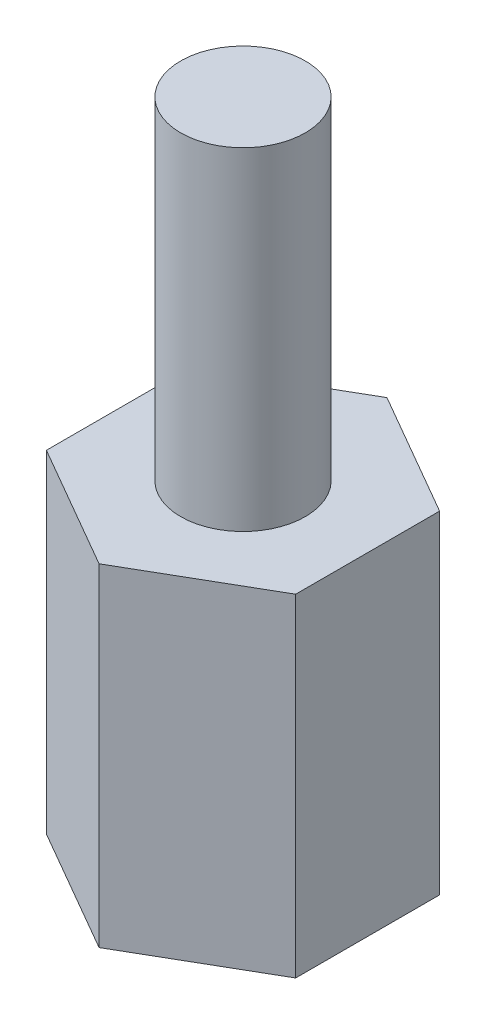
ISO-10303-21;
HEADER;
FILE_DESCRIPTION(('STEP AP214'),'2;1');
FILE_NAME('part.step','',(''),(''),'','','');
FILE_SCHEMA(('AUTOMOTIVE_DESIGN { 1 0 10303 214 1 1 1 1 }'));
ENDSEC;
DATA;
#1=APPLICATION_CONTEXT('core data for automotive mechanical design processes');
#2=APPLICATION_PROTOCOL_DEFINITION('international standard','automotive_design',2000,#1);
#3=PRODUCT_CONTEXT('',#1,'mechanical');
#4=PRODUCT('Part','Part','',(#3));
#5=PRODUCT_RELATED_PRODUCT_CATEGORY('part','',(#4));
#6=PRODUCT_DEFINITION_FORMATION('','',#4);
#7=PRODUCT_DEFINITION_CONTEXT('part definition',#1,'design');
#8=PRODUCT_DEFINITION('design','',#6,#7);
#9=PRODUCT_DEFINITION_SHAPE('','',#8);
#10=(LENGTH_UNIT() NAMED_UNIT(*) SI_UNIT(.MILLI.,.METRE.));
#11=(NAMED_UNIT(*) PLANE_ANGLE_UNIT() SI_UNIT($,.RADIAN.));
#12=(NAMED_UNIT(*) SI_UNIT($,.STERADIAN.) SOLID_ANGLE_UNIT());
#13=UNCERTAINTY_MEASURE_WITH_UNIT(LENGTH_MEASURE(1.E-05),#10,'distance_accuracy_value','');
#14=(GEOMETRIC_REPRESENTATION_CONTEXT(3) GLOBAL_UNCERTAINTY_ASSIGNED_CONTEXT((#13)) GLOBAL_UNIT_ASSIGNED_CONTEXT((#10,
#11,#12)) REPRESENTATION_CONTEXT('',''));
#15=CARTESIAN_POINT('',(0.,0.,0.));
#16=DIRECTION('',(0.,0.,1.));
#17=DIRECTION('',(1.,0.,0.));
#18=AXIS2_PLACEMENT_3D('',#15,#16,#17);
#19=CARTESIAN_POINT('',(0.,8.,0.));
#20=DIRECTION('',(0.,-1.,0.));
#21=DIRECTION('',(0.,0.,-1.));
#22=AXIS2_PLACEMENT_3D('',#19,#20,#21);
#23=CYLINDRICAL_SURFACE('',#22,1.5);
#24=CARTESIAN_POINT('',(0.,0.,0.));
#25=DIRECTION('',(0.,1.,0.));
#26=DIRECTION('',(0.,0.,1.));
#27=AXIS2_PLACEMENT_3D('',#24,#25,#26);
#28=CIRCLE('',#27,1.5);
#29=CARTESIAN_POINT('',(0.,0.,1.5));
#30=VERTEX_POINT('',#29);
#31=EDGE_CURVE('E229',#30,#30,#28,.T.);
#32=ORIENTED_EDGE('',*,*,#31,.F.);
#33=EDGE_LOOP('',(#32));
#34=FACE_BOUND('',#33,.T.);
#35=CARTESIAN_POINT('',(0.,5.,0.));
#36=DIRECTION('',(0.,1.,0.));
#37=DIRECTION('',(0.,0.,1.));
#38=AXIS2_PLACEMENT_3D('',#35,#36,#37);
#39=CIRCLE('',#38,1.5);
#40=CARTESIAN_POINT('',(0.,5.,1.5));
#41=VERTEX_POINT('',#40);
#42=EDGE_CURVE('E230',#41,#41,#39,.T.);
#43=ORIENTED_EDGE('',*,*,#42,.T.);
#44=EDGE_LOOP('',(#43));
#45=FACE_BOUND('',#44,.T.);
#46=ADVANCED_FACE('F33',(#34,#45),#23,.F.);
#47=CARTESIAN_POINT('',(0.,8.,0.));
#48=DIRECTION('',(0.,1.,0.));
#49=DIRECTION('',(0.,0.,1.));
#50=AXIS2_PLACEMENT_3D('',#47,#48,#49);
#51=PLANE('',#50);
#52=DIRECTION('',(-0.866025403784441,0.,-0.499999999999995));
#53=VECTOR('',#52,1.);
#54=CARTESIAN_POINT('',(2.99999999999998,8.,-1.73205080756891));
#55=LINE('',#54,#53);
#56=CARTESIAN_POINT('',(2.99999999999998,8.,-1.73205080756891));
#57=VERTEX_POINT('',#56);
#58=CARTESIAN_POINT('',(0.,8.,-3.46410161513775));
#59=VERTEX_POINT('',#58);
#60=EDGE_CURVE('E130',#57,#59,#55,.T.);
#61=ORIENTED_EDGE('',*,*,#60,.T.);
#62=DIRECTION('',(-0.866025403784438,0.,0.500000000000001));
#63=VECTOR('',#62,1.);
#64=CARTESIAN_POINT('',(0.,8.,-3.46410161513775));
#65=LINE('',#64,#63);
#66=CARTESIAN_POINT('',(-3.,8.,-1.73205080756887));
#67=VERTEX_POINT('',#66);
#68=EDGE_CURVE('E87',#59,#67,#65,.T.);
#69=ORIENTED_EDGE('',*,*,#68,.T.);
#70=DIRECTION('',(0.,0.,1.));
#71=VECTOR('',#70,1.);
#72=CARTESIAN_POINT('',(-3.,8.,-1.73205080756887));
#73=LINE('',#72,#71);
#74=CARTESIAN_POINT('',(-2.99999999999999,8.,1.73205080756889));
#75=VERTEX_POINT('',#74);
#76=EDGE_CURVE('E101',#67,#75,#73,.T.);
#77=ORIENTED_EDGE('',*,*,#76,.T.);
#78=DIRECTION('',(0.866025403784441,0.,0.499999999999995));
#79=VECTOR('',#78,1.);
#80=CARTESIAN_POINT('',(-2.99999999999999,8.,1.73205080756889));
#81=LINE('',#80,#79);
#82=CARTESIAN_POINT('',(0.,8.,3.46410161513775));
#83=VERTEX_POINT('',#82);
#84=EDGE_CURVE('E94',#75,#83,#81,.T.);
#85=ORIENTED_EDGE('',*,*,#84,.T.);
#86=DIRECTION('',(0.866025403784434,0.,-0.500000000000007));
#87=VECTOR('',#86,1.);
#88=CARTESIAN_POINT('',(0.,8.,3.46410161513775));
#89=LINE('',#88,#87);
#90=CARTESIAN_POINT('',(3.00000000000001,8.,1.73205080756885));
#91=VERTEX_POINT('',#90);
#92=EDGE_CURVE('E99',#83,#91,#89,.T.);
#93=ORIENTED_EDGE('',*,*,#92,.T.);
#94=DIRECTION('',(0.,0.,-1.));
#95=VECTOR('',#94,1.);
#96=CARTESIAN_POINT('',(3.00000000000001,8.,1.73205080756885));
#97=LINE('',#96,#95);
#98=EDGE_CURVE('E50',#91,#57,#97,.T.);
#99=ORIENTED_EDGE('',*,*,#98,.T.);
#100=EDGE_LOOP('',(#61,#69,#77,#85,#93,#99));
#101=FACE_BOUND('',#100,.T.);
#102=CARTESIAN_POINT('',(0.,8.,0.));
#103=DIRECTION('',(0.,1.,0.));
#104=DIRECTION('',(0.,0.,1.));
#105=AXIS2_PLACEMENT_3D('',#102,#103,#104);
#106=CIRCLE('',#105,1.5);
#107=CARTESIAN_POINT('',(0.,8.,1.5));
#108=VERTEX_POINT('',#107);
#109=EDGE_CURVE('E123',#108,#108,#106,.T.);
#110=ORIENTED_EDGE('',*,*,#109,.F.);
#111=EDGE_LOOP('',(#110));
#112=FACE_BOUND('',#111,.T.);
#113=ADVANCED_FACE('F96',(#101,#112),#51,.T.);
#114=CARTESIAN_POINT('',(0.,0.,0.));
#115=DIRECTION('',(0.,1.,0.));
#116=DIRECTION('',(0.,0.,1.));
#117=AXIS2_PLACEMENT_3D('',#114,#115,#116);
#118=PLANE('',#117);
#119=DIRECTION('',(-0.866025403784441,0.,-0.499999999999995));
#120=VECTOR('',#119,1.);
#121=CARTESIAN_POINT('',(2.99999999999998,0.,-1.73205080756891));
#122=LINE('',#121,#120);
#123=CARTESIAN_POINT('',(2.99999999999998,0.,-1.73205080756891));
#124=VERTEX_POINT('',#123);
#125=CARTESIAN_POINT('',(0.,0.,-3.46410161513775));
#126=VERTEX_POINT('',#125);
#127=EDGE_CURVE('E119',#124,#126,#122,.T.);
#128=ORIENTED_EDGE('',*,*,#127,.F.);
#129=DIRECTION('',(0.,0.,-1.));
#130=VECTOR('',#129,1.);
#131=CARTESIAN_POINT('',(3.00000000000001,0.,1.73205080756885));
#132=LINE('',#131,#130);
#133=CARTESIAN_POINT('',(3.00000000000001,0.,1.73205080756885));
#134=VERTEX_POINT('',#133);
#135=EDGE_CURVE('E79',#134,#124,#132,.T.);
#136=ORIENTED_EDGE('',*,*,#135,.F.);
#137=DIRECTION('',(0.866025403784434,0.,-0.500000000000007));
#138=VECTOR('',#137,1.);
#139=CARTESIAN_POINT('',(0.,0.,3.46410161513775));
#140=LINE('',#139,#138);
#141=CARTESIAN_POINT('',(0.,0.,3.46410161513775));
#142=VERTEX_POINT('',#141);
#143=EDGE_CURVE('E73',#142,#134,#140,.T.);
#144=ORIENTED_EDGE('',*,*,#143,.F.);
#145=DIRECTION('',(0.866025403784441,0.,0.499999999999995));
#146=VECTOR('',#145,1.);
#147=CARTESIAN_POINT('',(-2.99999999999999,0.,1.73205080756889));
#148=LINE('',#147,#146);
#149=CARTESIAN_POINT('',(-2.99999999999999,0.,1.73205080756889));
#150=VERTEX_POINT('',#149);
#151=EDGE_CURVE('E109',#150,#142,#148,.T.);
#152=ORIENTED_EDGE('',*,*,#151,.F.);
#153=DIRECTION('',(0.,0.,1.));
#154=VECTOR('',#153,1.);
#155=CARTESIAN_POINT('',(-3.,0.,-1.73205080756887));
#156=LINE('',#155,#154);
#157=CARTESIAN_POINT('',(-3.,0.,-1.73205080756887));
#158=VERTEX_POINT('',#157);
#159=EDGE_CURVE('E125',#158,#150,#156,.T.);
#160=ORIENTED_EDGE('',*,*,#159,.F.);
#161=DIRECTION('',(-0.866025403784438,0.,0.500000000000001));
#162=VECTOR('',#161,1.);
#163=CARTESIAN_POINT('',(0.,0.,-3.46410161513775));
#164=LINE('',#163,#162);
#165=EDGE_CURVE('E122',#126,#158,#164,.T.);
#166=ORIENTED_EDGE('',*,*,#165,.F.);
#167=EDGE_LOOP('',(#128,#136,#144,#152,#160,#166));
#168=FACE_BOUND('',#167,.T.);
#169=ORIENTED_EDGE('',*,*,#31,.T.);
#170=EDGE_LOOP('',(#169));
#171=FACE_BOUND('',#170,.T.);
#172=ADVANCED_FACE('F139',(#168,#171),#118,.F.);
#173=CARTESIAN_POINT('',(2.99999999999998,8.,-1.73205080756891));
#174=DIRECTION('',(-0.499999999999995,0.,0.866025403784441));
#175=DIRECTION('',(0.866025403784442,0.,0.499999999999995));
#176=AXIS2_PLACEMENT_3D('',#173,#174,#175);
#177=PLANE('',#176);
#178=ORIENTED_EDGE('',*,*,#127,.T.);
#179=DIRECTION('',(0.,-1.,0.));
#180=VECTOR('',#179,1.);
#181=CARTESIAN_POINT('',(0.,8.,-3.46410161513775));
#182=LINE('',#181,#180);
#183=EDGE_CURVE('E12',#59,#126,#182,.T.);
#184=ORIENTED_EDGE('',*,*,#183,.F.);
#185=ORIENTED_EDGE('',*,*,#60,.F.);
#186=DIRECTION('',(0.,-1.,0.));
#187=VECTOR('',#186,1.);
#188=CARTESIAN_POINT('',(2.99999999999998,8.,-1.73205080756891));
#189=LINE('',#188,#187);
#190=EDGE_CURVE('E115',#57,#124,#189,.T.);
#191=ORIENTED_EDGE('',*,*,#190,.T.);
#192=EDGE_LOOP('',(#178,#184,#185,#191));
#193=FACE_BOUND('',#192,.T.);
#194=ADVANCED_FACE('F35',(#193),#177,.F.);
#195=CARTESIAN_POINT('',(0.,8.,-3.46410161513775));
#196=DIRECTION('',(0.500000000000001,0.,0.866025403784438));
#197=DIRECTION('',(0.866025403784438,0.,-0.500000000000001));
#198=AXIS2_PLACEMENT_3D('',#195,#196,#197);
#199=PLANE('',#198);
#200=ORIENTED_EDGE('',*,*,#165,.T.);
#201=DIRECTION('',(0.,-1.,0.));
#202=VECTOR('',#201,1.);
#203=CARTESIAN_POINT('',(-3.,8.,-1.73205080756887));
#204=LINE('',#203,#202);
#205=EDGE_CURVE('E42',#67,#158,#204,.T.);
#206=ORIENTED_EDGE('',*,*,#205,.F.);
#207=ORIENTED_EDGE('',*,*,#68,.F.);
#208=ORIENTED_EDGE('',*,*,#183,.T.);
#209=EDGE_LOOP('',(#200,#206,#207,#208));
#210=FACE_BOUND('',#209,.T.);
#211=ADVANCED_FACE('F171',(#210),#199,.F.);
#212=CARTESIAN_POINT('',(-3.,8.,-1.73205080756887));
#213=DIRECTION('',(1.,0.,0.));
#214=DIRECTION('',(0.,0.,-1.));
#215=AXIS2_PLACEMENT_3D('',#212,#213,#214);
#216=PLANE('',#215);
#217=ORIENTED_EDGE('',*,*,#159,.T.);
#218=DIRECTION('',(0.,-1.,0.));
#219=VECTOR('',#218,1.);
#220=CARTESIAN_POINT('',(-2.99999999999999,8.,1.73205080756889));
#221=LINE('',#220,#219);
#222=EDGE_CURVE('E110',#75,#150,#221,.T.);
#223=ORIENTED_EDGE('',*,*,#222,.F.);
#224=ORIENTED_EDGE('',*,*,#76,.F.);
#225=ORIENTED_EDGE('',*,*,#205,.T.);
#226=EDGE_LOOP('',(#217,#223,#224,#225));
#227=FACE_BOUND('',#226,.T.);
#228=ADVANCED_FACE('F136',(#227),#216,.F.);
#229=CARTESIAN_POINT('',(-2.99999999999999,8.,1.73205080756889));
#230=DIRECTION('',(0.499999999999995,0.,-0.866025403784441));
#231=DIRECTION('',(-0.866025403784442,0.,-0.499999999999995));
#232=AXIS2_PLACEMENT_3D('',#229,#230,#231);
#233=PLANE('',#232);
#234=ORIENTED_EDGE('',*,*,#151,.T.);
#235=DIRECTION('',(0.,-1.,0.));
#236=VECTOR('',#235,1.);
#237=CARTESIAN_POINT('',(0.,8.,3.46410161513775));
#238=LINE('',#237,#236);
#239=EDGE_CURVE('E106',#83,#142,#238,.T.);
#240=ORIENTED_EDGE('',*,*,#239,.F.);
#241=ORIENTED_EDGE('',*,*,#84,.F.);
#242=ORIENTED_EDGE('',*,*,#222,.T.);
#243=EDGE_LOOP('',(#234,#240,#241,#242));
#244=FACE_BOUND('',#243,.T.);
#245=ADVANCED_FACE('F107',(#244),#233,.F.);
#246=CARTESIAN_POINT('',(0.,8.,3.46410161513775));
#247=DIRECTION('',(-0.500000000000007,0.,-0.866025403784435));
#248=DIRECTION('',(-0.866025403784434,0.,0.500000000000007));
#249=AXIS2_PLACEMENT_3D('',#246,#247,#248);
#250=PLANE('',#249);
#251=ORIENTED_EDGE('',*,*,#143,.T.);
#252=DIRECTION('',(0.,-1.,0.));
#253=VECTOR('',#252,1.);
#254=CARTESIAN_POINT('',(3.00000000000001,8.,1.73205080756885));
#255=LINE('',#254,#253);
#256=EDGE_CURVE('E111',#91,#134,#255,.T.);
#257=ORIENTED_EDGE('',*,*,#256,.F.);
#258=ORIENTED_EDGE('',*,*,#92,.F.);
#259=ORIENTED_EDGE('',*,*,#239,.T.);
#260=EDGE_LOOP('',(#251,#257,#258,#259));
#261=FACE_BOUND('',#260,.T.);
#262=ADVANCED_FACE('F113',(#261),#250,.F.);
#263=CARTESIAN_POINT('',(3.00000000000001,8.,1.73205080756885));
#264=DIRECTION('',(-1.,0.,0.));
#265=DIRECTION('',(0.,0.,1.));
#266=AXIS2_PLACEMENT_3D('',#263,#264,#265);
#267=PLANE('',#266);
#268=ORIENTED_EDGE('',*,*,#135,.T.);
#269=ORIENTED_EDGE('',*,*,#190,.F.);
#270=ORIENTED_EDGE('',*,*,#98,.F.);
#271=ORIENTED_EDGE('',*,*,#256,.T.);
#272=EDGE_LOOP('',(#268,#269,#270,#271));
#273=FACE_BOUND('',#272,.T.);
#274=ADVANCED_FACE('F144',(#273),#267,.F.);
#275=CARTESIAN_POINT('',(0.,5.,0.));
#276=DIRECTION('',(0.,1.,0.));
#277=DIRECTION('',(0.,0.,1.));
#278=AXIS2_PLACEMENT_3D('',#275,#276,#277);
#279=PLANE('',#278);
#280=ORIENTED_EDGE('',*,*,#42,.F.);
#281=EDGE_LOOP('',(#280));
#282=FACE_BOUND('',#281,.T.);
#283=ADVANCED_FACE('F146',(#282),#279,.F.);
#284=CARTESIAN_POINT('',(0.,16.,0.));
#285=DIRECTION('',(0.,-1.,0.));
#286=DIRECTION('',(0.,0.,-1.));
#287=AXIS2_PLACEMENT_3D('',#284,#285,#286);
#288=CYLINDRICAL_SURFACE('',#287,1.5);
#289=ORIENTED_EDGE('',*,*,#109,.T.);
#290=EDGE_LOOP('',(#289));
#291=FACE_BOUND('',#290,.T.);
#292=CARTESIAN_POINT('',(0.,16.,0.));
#293=DIRECTION('',(0.,1.,0.));
#294=DIRECTION('',(0.,0.,1.));
#295=AXIS2_PLACEMENT_3D('',#292,#293,#294);
#296=CIRCLE('',#295,1.5);
#297=CARTESIAN_POINT('',(0.,16.,1.5));
#298=VERTEX_POINT('',#297);
#299=EDGE_CURVE('E227',#298,#298,#296,.T.);
#300=ORIENTED_EDGE('',*,*,#299,.F.);
#301=EDGE_LOOP('',(#300));
#302=FACE_BOUND('',#301,.T.);
#303=ADVANCED_FACE('F152',(#291,#302),#288,.T.);
#304=CARTESIAN_POINT('',(0.,16.,0.));
#305=DIRECTION('',(0.,1.,0.));
#306=DIRECTION('',(0.,0.,1.));
#307=AXIS2_PLACEMENT_3D('',#304,#305,#306);
#308=PLANE('',#307);
#309=ORIENTED_EDGE('',*,*,#299,.T.);
#310=EDGE_LOOP('',(#309));
#311=FACE_BOUND('',#310,.T.);
#312=ADVANCED_FACE('F212',(#311),#308,.T.);
#313=CLOSED_SHELL('',(#46,#113,#172,#194,#211,#228,#245,#262,#274,#283,#303,#312));
#314=MANIFOLD_SOLID_BREP('B2',#313);
#315=ADVANCED_BREP_SHAPE_REPRESENTATION('',(#18,#314),#14);
#316=SHAPE_DEFINITION_REPRESENTATION(#9,#315);
ENDSEC;
END-ISO-10303-21;
